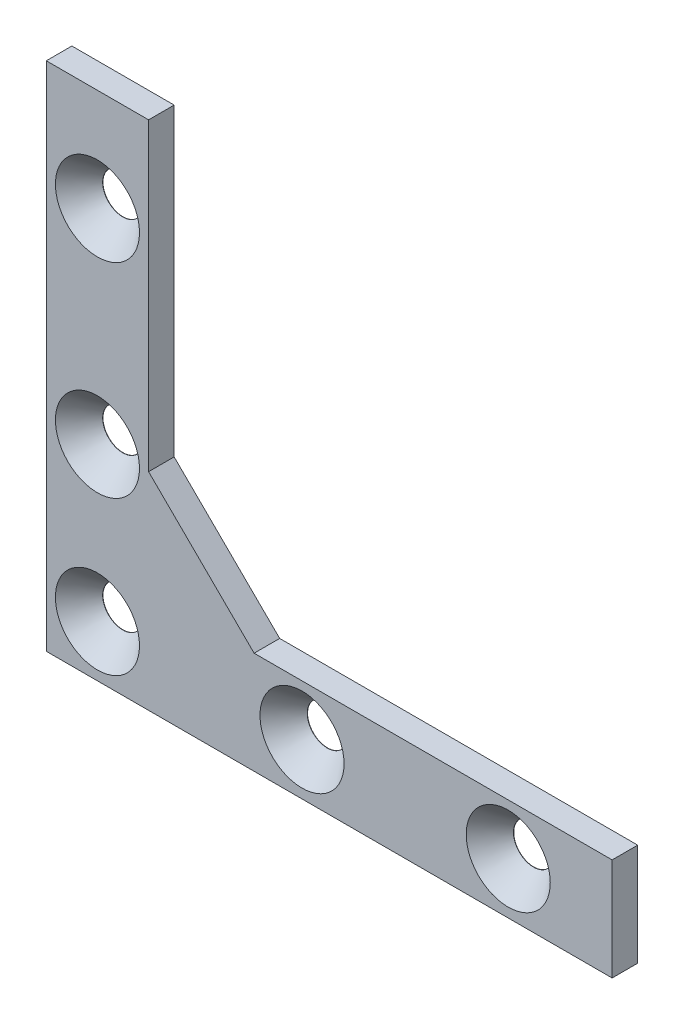
ISO-10303-21;
HEADER;
FILE_DESCRIPTION(('STEP AP214'),'2;1');
FILE_NAME('part.step','',(''),(''),'','','');
FILE_SCHEMA(('AUTOMOTIVE_DESIGN { 1 0 10303 214 1 1 1 1 }'));
ENDSEC;
DATA;
#1=APPLICATION_CONTEXT('core data for automotive mechanical design processes');
#2=APPLICATION_PROTOCOL_DEFINITION('international standard','automotive_design',2000,#1);
#3=PRODUCT_CONTEXT('',#1,'mechanical');
#4=PRODUCT('Part','Part','',(#3));
#5=PRODUCT_RELATED_PRODUCT_CATEGORY('part','',(#4));
#6=PRODUCT_DEFINITION_FORMATION('','',#4);
#7=PRODUCT_DEFINITION_CONTEXT('part definition',#1,'design');
#8=PRODUCT_DEFINITION('design','',#6,#7);
#9=PRODUCT_DEFINITION_SHAPE('','',#8);
#10=(LENGTH_UNIT() NAMED_UNIT(*) SI_UNIT(.MILLI.,.METRE.));
#11=(NAMED_UNIT(*) PLANE_ANGLE_UNIT() SI_UNIT($,.RADIAN.));
#12=(NAMED_UNIT(*) SI_UNIT($,.STERADIAN.) SOLID_ANGLE_UNIT());
#13=UNCERTAINTY_MEASURE_WITH_UNIT(LENGTH_MEASURE(1.E-05),#10,'distance_accuracy_value','');
#14=(GEOMETRIC_REPRESENTATION_CONTEXT(3) GLOBAL_UNCERTAINTY_ASSIGNED_CONTEXT((#13)) GLOBAL_UNIT_ASSIGNED_CONTEXT((#10,
#11,#12)) REPRESENTATION_CONTEXT('',''));
#15=CARTESIAN_POINT('',(0.,0.,0.));
#16=DIRECTION('',(0.,0.,1.));
#17=DIRECTION('',(1.,0.,0.));
#18=AXIS2_PLACEMENT_3D('',#15,#16,#17);
#19=CARTESIAN_POINT('',(-203.200000508,0.,3.175));
#20=DIRECTION('',(-1.,0.,0.));
#21=DIRECTION('',(0.,0.,1.));
#22=AXIS2_PLACEMENT_3D('',#19,#20,#21);
#23=PLANE('',#22);
#24=DIRECTION('',(0.,1.,0.));
#25=VECTOR('',#24,1.);
#26=CARTESIAN_POINT('',(-203.200000508,0.,0.));
#27=LINE('',#26,#25);
#28=CARTESIAN_POINT('',(-203.200000508,0.,0.));
#29=VERTEX_POINT('',#28);
#30=CARTESIAN_POINT('',(-203.200000508,12.7,0.));
#31=VERTEX_POINT('',#30);
#32=EDGE_CURVE('E131',#29,#31,#27,.T.);
#33=ORIENTED_EDGE('',*,*,#32,.T.);
#34=DIRECTION('',(0.,0.,-1.));
#35=VECTOR('',#34,1.);
#36=CARTESIAN_POINT('',(-203.200000508,12.7,3.175));
#37=LINE('',#36,#35);
#38=CARTESIAN_POINT('',(-203.200000508,12.7,3.175));
#39=VERTEX_POINT('',#38);
#40=EDGE_CURVE('E45',#39,#31,#37,.T.);
#41=ORIENTED_EDGE('',*,*,#40,.F.);
#42=DIRECTION('',(0.,1.,0.));
#43=VECTOR('',#42,1.);
#44=CARTESIAN_POINT('',(-203.200000508,0.,3.175));
#45=LINE('',#44,#43);
#46=CARTESIAN_POINT('',(-203.200000508,0.,3.175));
#47=VERTEX_POINT('',#46);
#48=EDGE_CURVE('E94',#47,#39,#45,.T.);
#49=ORIENTED_EDGE('',*,*,#48,.F.);
#50=DIRECTION('',(0.,0.,-1.));
#51=VECTOR('',#50,1.);
#52=CARTESIAN_POINT('',(-203.200000508,0.,3.175));
#53=LINE('',#52,#51);
#54=EDGE_CURVE('E11',#47,#29,#53,.T.);
#55=ORIENTED_EDGE('',*,*,#54,.T.);
#56=EDGE_LOOP('',(#33,#41,#49,#55));
#57=FACE_BOUND('',#56,.T.);
#58=ADVANCED_FACE('F37',(#57),#23,.F.);
#59=CARTESIAN_POINT('',(-203.200000508,12.7,3.175));
#60=DIRECTION('',(0.,-1.,0.));
#61=DIRECTION('',(1.,0.,0.));
#62=AXIS2_PLACEMENT_3D('',#59,#60,#61);
#63=PLANE('',#62);
#64=DIRECTION('',(-1.,0.,0.));
#65=VECTOR('',#64,1.);
#66=CARTESIAN_POINT('',(-203.200000508,12.7,0.));
#67=LINE('',#66,#65);
#68=CARTESIAN_POINT('',(-247.650000508,12.7,0.));
#69=VERTEX_POINT('',#68);
#70=EDGE_CURVE('E133',#31,#69,#67,.T.);
#71=ORIENTED_EDGE('',*,*,#70,.T.);
#72=DIRECTION('',(0.,0.,-1.));
#73=VECTOR('',#72,1.);
#74=CARTESIAN_POINT('',(-247.650000508,12.7,3.175));
#75=LINE('',#74,#73);
#76=CARTESIAN_POINT('',(-247.650000508,12.7,3.175));
#77=VERTEX_POINT('',#76);
#78=EDGE_CURVE('E146',#77,#69,#75,.T.);
#79=ORIENTED_EDGE('',*,*,#78,.F.);
#80=DIRECTION('',(-1.,0.,0.));
#81=VECTOR('',#80,1.);
#82=CARTESIAN_POINT('',(-203.200000508,12.7,3.175));
#83=LINE('',#82,#81);
#84=EDGE_CURVE('E154',#39,#77,#83,.T.);
#85=ORIENTED_EDGE('',*,*,#84,.F.);
#86=ORIENTED_EDGE('',*,*,#40,.T.);
#87=EDGE_LOOP('',(#71,#79,#85,#86));
#88=FACE_BOUND('',#87,.T.);
#89=ADVANCED_FACE('F152',(#88),#63,.F.);
#90=CARTESIAN_POINT('',(-247.650000508,12.7,3.175));
#91=DIRECTION('',(-0.703372247790285,-0.710821694265476,0.));
#92=DIRECTION('',(0.710821694265476,-0.703372247790285,0.));
#93=AXIS2_PLACEMENT_3D('',#90,#91,#92);
#94=PLANE('',#93);
#95=DIRECTION('',(-0.710821694265476,0.703372247790285,0.));
#96=VECTOR('',#95,1.);
#97=CARTESIAN_POINT('',(-247.650000508,12.7,0.));
#98=LINE('',#97,#96);
#99=CARTESIAN_POINT('',(-260.753367516007,25.6660430743707,0.));
#100=VERTEX_POINT('',#99);
#101=EDGE_CURVE('E136',#69,#100,#98,.T.);
#102=ORIENTED_EDGE('',*,*,#101,.T.);
#103=DIRECTION('',(0.,0.,-1.));
#104=VECTOR('',#103,1.);
#105=CARTESIAN_POINT('',(-260.753367516007,25.6660430743707,3.175));
#106=LINE('',#105,#104);
#107=CARTESIAN_POINT('',(-260.753367516007,25.6660430743707,3.175));
#108=VERTEX_POINT('',#107);
#109=EDGE_CURVE('E120',#108,#100,#106,.T.);
#110=ORIENTED_EDGE('',*,*,#109,.F.);
#111=DIRECTION('',(-0.710821694265476,0.703372247790285,0.));
#112=VECTOR('',#111,1.);
#113=CARTESIAN_POINT('',(-247.650000508,12.7,3.175));
#114=LINE('',#113,#112);
#115=EDGE_CURVE('E111',#77,#108,#114,.T.);
#116=ORIENTED_EDGE('',*,*,#115,.F.);
#117=ORIENTED_EDGE('',*,*,#78,.T.);
#118=EDGE_LOOP('',(#102,#110,#116,#117));
#119=FACE_BOUND('',#118,.T.);
#120=ADVANCED_FACE('F161',(#119),#94,.F.);
#121=CARTESIAN_POINT('',(-260.753367516007,25.6660430743707,3.175));
#122=DIRECTION('',(-1.,0.,0.));
#123=DIRECTION('',(0.,0.,1.));
#124=AXIS2_PLACEMENT_3D('',#121,#122,#123);
#125=PLANE('',#124);
#126=DIRECTION('',(0.,1.,0.));
#127=VECTOR('',#126,1.);
#128=CARTESIAN_POINT('',(-260.753367516007,25.6660430743707,0.));
#129=LINE('',#128,#127);
#130=CARTESIAN_POINT('',(-260.753367516007,63.5,0.));
#131=VERTEX_POINT('',#130);
#132=EDGE_CURVE('E119',#100,#131,#129,.T.);
#133=ORIENTED_EDGE('',*,*,#132,.T.);
#134=DIRECTION('',(0.,0.,-1.));
#135=VECTOR('',#134,1.);
#136=CARTESIAN_POINT('',(-260.753367516007,63.5,3.175));
#137=LINE('',#136,#135);
#138=CARTESIAN_POINT('',(-260.753367516007,63.5,3.175));
#139=VERTEX_POINT('',#138);
#140=EDGE_CURVE('E116',#139,#131,#137,.T.);
#141=ORIENTED_EDGE('',*,*,#140,.F.);
#142=DIRECTION('',(0.,1.,0.));
#143=VECTOR('',#142,1.);
#144=CARTESIAN_POINT('',(-260.753367516007,25.6660430743707,3.175));
#145=LINE('',#144,#143);
#146=EDGE_CURVE('E105',#108,#139,#145,.T.);
#147=ORIENTED_EDGE('',*,*,#146,.F.);
#148=ORIENTED_EDGE('',*,*,#109,.T.);
#149=EDGE_LOOP('',(#133,#141,#147,#148));
#150=FACE_BOUND('',#149,.T.);
#151=ADVANCED_FACE('F117',(#150),#125,.F.);
#152=CARTESIAN_POINT('',(-273.453367516007,63.5,3.175));
#153=DIRECTION('',(0.,-1.,0.));
#154=DIRECTION('',(0.,0.,-1.));
#155=AXIS2_PLACEMENT_3D('',#152,#153,#154);
#156=PLANE('',#155);
#157=DIRECTION('',(-1.,0.,0.));
#158=VECTOR('',#157,1.);
#159=CARTESIAN_POINT('',(-273.453367516007,63.5,0.));
#160=LINE('',#159,#158);
#161=CARTESIAN_POINT('',(-273.453367516007,63.5,0.));
#162=VERTEX_POINT('',#161);
#163=EDGE_CURVE('E80',#131,#162,#160,.T.);
#164=ORIENTED_EDGE('',*,*,#163,.T.);
#165=DIRECTION('',(0.,0.,-1.));
#166=VECTOR('',#165,1.);
#167=CARTESIAN_POINT('',(-273.453367516007,63.5,3.175));
#168=LINE('',#167,#166);
#169=CARTESIAN_POINT('',(-273.453367516007,63.5,3.175));
#170=VERTEX_POINT('',#169);
#171=EDGE_CURVE('E121',#170,#162,#168,.T.);
#172=ORIENTED_EDGE('',*,*,#171,.F.);
#173=DIRECTION('',(-1.,0.,0.));
#174=VECTOR('',#173,1.);
#175=CARTESIAN_POINT('',(-273.453367516007,63.5,3.175));
#176=LINE('',#175,#174);
#177=EDGE_CURVE('E109',#139,#170,#176,.T.);
#178=ORIENTED_EDGE('',*,*,#177,.F.);
#179=ORIENTED_EDGE('',*,*,#140,.T.);
#180=EDGE_LOOP('',(#164,#172,#178,#179));
#181=FACE_BOUND('',#180,.T.);
#182=ADVANCED_FACE('F123',(#181),#156,.F.);
#183=CARTESIAN_POINT('',(-273.453367516007,0.,3.175));
#184=DIRECTION('',(1.,0.,0.));
#185=DIRECTION('',(0.,0.,-1.));
#186=AXIS2_PLACEMENT_3D('',#183,#184,#185);
#187=PLANE('',#186);
#188=DIRECTION('',(0.,-1.,0.));
#189=VECTOR('',#188,1.);
#190=CARTESIAN_POINT('',(-273.453367516007,0.,0.));
#191=LINE('',#190,#189);
#192=CARTESIAN_POINT('',(-273.453367516007,0.,0.));
#193=VERTEX_POINT('',#192);
#194=EDGE_CURVE('E87',#162,#193,#191,.T.);
#195=ORIENTED_EDGE('',*,*,#194,.T.);
#196=DIRECTION('',(0.,0.,-1.));
#197=VECTOR('',#196,1.);
#198=CARTESIAN_POINT('',(-273.453367516007,0.,3.175));
#199=LINE('',#198,#197);
#200=CARTESIAN_POINT('',(-273.453367516007,0.,3.175));
#201=VERTEX_POINT('',#200);
#202=EDGE_CURVE('E127',#201,#193,#199,.T.);
#203=ORIENTED_EDGE('',*,*,#202,.F.);
#204=DIRECTION('',(0.,-1.,0.));
#205=VECTOR('',#204,1.);
#206=CARTESIAN_POINT('',(-273.453367516007,0.,3.175));
#207=LINE('',#206,#205);
#208=EDGE_CURVE('E125',#170,#201,#207,.T.);
#209=ORIENTED_EDGE('',*,*,#208,.F.);
#210=ORIENTED_EDGE('',*,*,#171,.T.);
#211=EDGE_LOOP('',(#195,#203,#209,#210));
#212=FACE_BOUND('',#211,.T.);
#213=ADVANCED_FACE('F245',(#212),#187,.F.);
#214=CARTESIAN_POINT('',(-260.350000508,0.,3.175));
#215=DIRECTION('',(0.,1.,0.));
#216=DIRECTION('',(-1.,0.,0.));
#217=AXIS2_PLACEMENT_3D('',#214,#215,#216);
#218=PLANE('',#217);
#219=DIRECTION('',(1.,0.,0.));
#220=VECTOR('',#219,1.);
#221=CARTESIAN_POINT('',(-260.350000508,0.,0.));
#222=LINE('',#221,#220);
#223=EDGE_CURVE('E141',#193,#29,#222,.T.);
#224=ORIENTED_EDGE('',*,*,#223,.T.);
#225=ORIENTED_EDGE('',*,*,#54,.F.);
#226=DIRECTION('',(1.,0.,0.));
#227=VECTOR('',#226,1.);
#228=CARTESIAN_POINT('',(-260.350000508,0.,3.175));
#229=LINE('',#228,#227);
#230=EDGE_CURVE('E53',#201,#47,#229,.T.);
#231=ORIENTED_EDGE('',*,*,#230,.F.);
#232=ORIENTED_EDGE('',*,*,#202,.T.);
#233=EDGE_LOOP('',(#224,#225,#231,#232));
#234=FACE_BOUND('',#233,.T.);
#235=ADVANCED_FACE('F215',(#234),#218,.F.);
#236=CARTESIAN_POINT('',(0.,0.,3.175));
#237=DIRECTION('',(0.,0.,1.));
#238=DIRECTION('',(1.,0.,0.));
#239=AXIS2_PLACEMENT_3D('',#236,#237,#238);
#240=PLANE('',#239);
#241=CARTESIAN_POINT('',(-267.103367516007,6.38822941469469,3.175));
#242=DIRECTION('',(0.,0.,1.));
#243=DIRECTION('',(1.,0.,0.));
#244=AXIS2_PLACEMENT_3D('',#241,#242,#243);
#245=CIRCLE('',#244,5.21969999999999);
#246=CARTESIAN_POINT('',(-261.883667516008,6.38822941469469,3.175));
#247=VERTEX_POINT('',#246);
#248=EDGE_CURVE('E207',#247,#247,#245,.T.);
#249=ORIENTED_EDGE('',*,*,#248,.F.);
#250=EDGE_LOOP('',(#249));
#251=FACE_BOUND('',#250,.T.);
#252=CARTESIAN_POINT('',(-267.103367516007,25.4382294146947,3.175));
#253=DIRECTION('',(0.,0.,1.));
#254=DIRECTION('',(1.,0.,0.));
#255=AXIS2_PLACEMENT_3D('',#252,#253,#254);
#256=CIRCLE('',#255,5.21969999999999);
#257=CARTESIAN_POINT('',(-261.883667516008,25.4382294146947,3.175));
#258=VERTEX_POINT('',#257);
#259=EDGE_CURVE('E198',#258,#258,#256,.T.);
#260=ORIENTED_EDGE('',*,*,#259,.F.);
#261=EDGE_LOOP('',(#260));
#262=FACE_BOUND('',#261,.T.);
#263=CARTESIAN_POINT('',(-267.103367516007,50.8,3.175));
#264=DIRECTION('',(0.,0.,1.));
#265=DIRECTION('',(1.,0.,0.));
#266=AXIS2_PLACEMENT_3D('',#263,#264,#265);
#267=CIRCLE('',#266,5.21969999999999);
#268=CARTESIAN_POINT('',(-261.883667516008,50.8,3.175));
#269=VERTEX_POINT('',#268);
#270=EDGE_CURVE('E189',#269,#269,#267,.T.);
#271=ORIENTED_EDGE('',*,*,#270,.F.);
#272=EDGE_LOOP('',(#271));
#273=FACE_BOUND('',#272,.T.);
#274=CARTESIAN_POINT('',(-241.703367516007,6.38822941469469,3.175));
#275=DIRECTION('',(0.,0.,1.));
#276=DIRECTION('',(1.,0.,0.));
#277=AXIS2_PLACEMENT_3D('',#274,#275,#276);
#278=CIRCLE('',#277,5.21969999999999);
#279=CARTESIAN_POINT('',(-236.483667516008,6.38822941469469,3.175));
#280=VERTEX_POINT('',#279);
#281=EDGE_CURVE('E180',#280,#280,#278,.T.);
#282=ORIENTED_EDGE('',*,*,#281,.F.);
#283=EDGE_LOOP('',(#282));
#284=FACE_BOUND('',#283,.T.);
#285=CARTESIAN_POINT('',(-216.101684012004,6.38822941469469,3.175));
#286=DIRECTION('',(0.,0.,1.));
#287=DIRECTION('',(1.,0.,0.));
#288=AXIS2_PLACEMENT_3D('',#285,#286,#287);
#289=CIRCLE('',#288,5.21969999999999);
#290=CARTESIAN_POINT('',(-210.881984012004,6.38822941469469,3.175));
#291=VERTEX_POINT('',#290);
#292=EDGE_CURVE('E171',#291,#291,#289,.T.);
#293=ORIENTED_EDGE('',*,*,#292,.F.);
#294=EDGE_LOOP('',(#293));
#295=FACE_BOUND('',#294,.T.);
#296=ORIENTED_EDGE('',*,*,#230,.T.);
#297=ORIENTED_EDGE('',*,*,#48,.T.);
#298=ORIENTED_EDGE('',*,*,#84,.T.);
#299=ORIENTED_EDGE('',*,*,#115,.T.);
#300=ORIENTED_EDGE('',*,*,#146,.T.);
#301=ORIENTED_EDGE('',*,*,#177,.T.);
#302=ORIENTED_EDGE('',*,*,#208,.T.);
#303=EDGE_LOOP('',(#296,#297,#298,#299,#300,#301,#302));
#304=FACE_BOUND('',#303,.T.);
#305=ADVANCED_FACE('F107',(#251,#262,#273,#284,#295,#304),#240,.T.);
#306=CARTESIAN_POINT('',(0.,0.,0.));
#307=DIRECTION('',(0.,0.,1.));
#308=DIRECTION('',(1.,0.,0.));
#309=AXIS2_PLACEMENT_3D('',#306,#307,#308);
#310=PLANE('',#309);
#311=CARTESIAN_POINT('',(-267.103367516007,6.38822941469469,0.));
#312=DIRECTION('',(0.,0.,1.));
#313=DIRECTION('',(1.,0.,0.));
#314=AXIS2_PLACEMENT_3D('',#311,#312,#313);
#315=CIRCLE('',#314,2.48920000000002);
#316=CARTESIAN_POINT('',(-264.614167516007,6.38822941469469,0.));
#317=VERTEX_POINT('',#316);
#318=EDGE_CURVE('E201',#317,#317,#315,.T.);
#319=ORIENTED_EDGE('',*,*,#318,.T.);
#320=EDGE_LOOP('',(#319));
#321=FACE_BOUND('',#320,.T.);
#322=CARTESIAN_POINT('',(-267.103367516007,25.4382294146947,0.));
#323=DIRECTION('',(0.,0.,1.));
#324=DIRECTION('',(1.,0.,0.));
#325=AXIS2_PLACEMENT_3D('',#322,#323,#324);
#326=CIRCLE('',#325,2.48920000000002);
#327=CARTESIAN_POINT('',(-264.614167516007,25.4382294146947,0.));
#328=VERTEX_POINT('',#327);
#329=EDGE_CURVE('E192',#328,#328,#326,.T.);
#330=ORIENTED_EDGE('',*,*,#329,.T.);
#331=EDGE_LOOP('',(#330));
#332=FACE_BOUND('',#331,.T.);
#333=CARTESIAN_POINT('',(-267.103367516007,50.8,0.));
#334=DIRECTION('',(0.,0.,1.));
#335=DIRECTION('',(1.,0.,0.));
#336=AXIS2_PLACEMENT_3D('',#333,#334,#335);
#337=CIRCLE('',#336,2.48920000000002);
#338=CARTESIAN_POINT('',(-264.614167516007,50.8,0.));
#339=VERTEX_POINT('',#338);
#340=EDGE_CURVE('E183',#339,#339,#337,.T.);
#341=ORIENTED_EDGE('',*,*,#340,.T.);
#342=EDGE_LOOP('',(#341));
#343=FACE_BOUND('',#342,.T.);
#344=CARTESIAN_POINT('',(-241.703367516007,6.38822941469469,0.));
#345=DIRECTION('',(0.,0.,1.));
#346=DIRECTION('',(1.,0.,0.));
#347=AXIS2_PLACEMENT_3D('',#344,#345,#346);
#348=CIRCLE('',#347,2.4892);
#349=CARTESIAN_POINT('',(-239.214167516007,6.38822941469469,0.));
#350=VERTEX_POINT('',#349);
#351=EDGE_CURVE('E174',#350,#350,#348,.T.);
#352=ORIENTED_EDGE('',*,*,#351,.T.);
#353=EDGE_LOOP('',(#352));
#354=FACE_BOUND('',#353,.T.);
#355=CARTESIAN_POINT('',(-216.101684012004,6.38822941469469,0.));
#356=DIRECTION('',(0.,0.,1.));
#357=DIRECTION('',(1.,0.,0.));
#358=AXIS2_PLACEMENT_3D('',#355,#356,#357);
#359=CIRCLE('',#358,2.4892);
#360=CARTESIAN_POINT('',(-213.612484012004,6.38822941469469,0.));
#361=VERTEX_POINT('',#360);
#362=EDGE_CURVE('E134',#361,#361,#359,.T.);
#363=ORIENTED_EDGE('',*,*,#362,.T.);
#364=EDGE_LOOP('',(#363));
#365=FACE_BOUND('',#364,.T.);
#366=ORIENTED_EDGE('',*,*,#32,.F.);
#367=ORIENTED_EDGE('',*,*,#223,.F.);
#368=ORIENTED_EDGE('',*,*,#194,.F.);
#369=ORIENTED_EDGE('',*,*,#163,.F.);
#370=ORIENTED_EDGE('',*,*,#132,.F.);
#371=ORIENTED_EDGE('',*,*,#101,.F.);
#372=ORIENTED_EDGE('',*,*,#70,.F.);
#373=EDGE_LOOP('',(#366,#367,#368,#369,#370,#371,#372));
#374=FACE_BOUND('',#373,.T.);
#375=ADVANCED_FACE('F158',(#321,#332,#343,#354,#365,#374),#310,.F.);
#376=CARTESIAN_POINT('',(-216.101684012004,6.38822941469469,3.175));
#377=DIRECTION('',(0.,0.,1.));
#378=DIRECTION('',(1.,0.,0.));
#379=AXIS2_PLACEMENT_3D('',#376,#377,#378);
#380=CYLINDRICAL_SURFACE('',#379,2.4892);
#381=ORIENTED_EDGE('',*,*,#362,.F.);
#382=EDGE_LOOP('',(#381));
#383=FACE_BOUND('',#382,.T.);
#384=CARTESIAN_POINT('',(-216.101684012004,6.38822941469469,0.0339190640830126));
#385=DIRECTION('',(0.,0.,1.));
#386=DIRECTION('',(1.,0.,0.));
#387=AXIS2_PLACEMENT_3D('',#384,#385,#386);
#388=CIRCLE('',#387,2.4892);
#389=CARTESIAN_POINT('',(-213.612484012004,6.38822941469469,0.0339190640830126));
#390=VERTEX_POINT('',#389);
#391=EDGE_CURVE('E168',#390,#390,#388,.T.);
#392=ORIENTED_EDGE('',*,*,#391,.T.);
#393=EDGE_LOOP('',(#392));
#394=FACE_BOUND('',#393,.T.);
#395=ADVANCED_FACE('F228',(#383,#394),#380,.F.);
#396=CARTESIAN_POINT('',(-216.101684012004,6.38822941469469,3.175));
#397=DIRECTION('',(0.,0.,1.));
#398=DIRECTION('',(1.,0.,0.));
#399=AXIS2_PLACEMENT_3D('',#396,#397,#398);
#400=CONICAL_SURFACE('',#399,5.21969999999999,0.715584993317671);
#401=ORIENTED_EDGE('',*,*,#391,.F.);
#402=EDGE_LOOP('',(#401));
#403=FACE_BOUND('',#402,.T.);
#404=ORIENTED_EDGE('',*,*,#292,.T.);
#405=EDGE_LOOP('',(#404));
#406=FACE_BOUND('',#405,.T.);
#407=ADVANCED_FACE('F225',(#403,#406),#400,.F.);
#408=CARTESIAN_POINT('',(-241.703367516007,6.38822941469469,3.175));
#409=DIRECTION('',(0.,0.,1.));
#410=DIRECTION('',(1.,0.,0.));
#411=AXIS2_PLACEMENT_3D('',#408,#409,#410);
#412=CYLINDRICAL_SURFACE('',#411,2.4892);
#413=ORIENTED_EDGE('',*,*,#351,.F.);
#414=EDGE_LOOP('',(#413));
#415=FACE_BOUND('',#414,.T.);
#416=CARTESIAN_POINT('',(-241.703367516007,6.38822941469469,0.0339190640830126));
#417=DIRECTION('',(0.,0.,1.));
#418=DIRECTION('',(1.,0.,0.));
#419=AXIS2_PLACEMENT_3D('',#416,#417,#418);
#420=CIRCLE('',#419,2.4892);
#421=CARTESIAN_POINT('',(-239.214167516007,6.38822941469469,0.0339190640830126));
#422=VERTEX_POINT('',#421);
#423=EDGE_CURVE('E177',#422,#422,#420,.T.);
#424=ORIENTED_EDGE('',*,*,#423,.T.);
#425=EDGE_LOOP('',(#424));
#426=FACE_BOUND('',#425,.T.);
#427=ADVANCED_FACE('F227',(#415,#426),#412,.F.);
#428=CARTESIAN_POINT('',(-241.703367516007,6.38822941469469,3.175));
#429=DIRECTION('',(0.,0.,1.));
#430=DIRECTION('',(1.,0.,0.));
#431=AXIS2_PLACEMENT_3D('',#428,#429,#430);
#432=CONICAL_SURFACE('',#431,5.21969999999999,0.715584993317671);
#433=ORIENTED_EDGE('',*,*,#423,.F.);
#434=EDGE_LOOP('',(#433));
#435=FACE_BOUND('',#434,.T.);
#436=ORIENTED_EDGE('',*,*,#281,.T.);
#437=EDGE_LOOP('',(#436));
#438=FACE_BOUND('',#437,.T.);
#439=ADVANCED_FACE('F235',(#435,#438),#432,.F.);
#440=CARTESIAN_POINT('',(-267.103367516007,50.8,3.175));
#441=DIRECTION('',(0.,0.,1.));
#442=DIRECTION('',(1.,0.,0.));
#443=AXIS2_PLACEMENT_3D('',#440,#441,#442);
#444=CYLINDRICAL_SURFACE('',#443,2.4892);
#445=ORIENTED_EDGE('',*,*,#340,.F.);
#446=EDGE_LOOP('',(#445));
#447=FACE_BOUND('',#446,.T.);
#448=CARTESIAN_POINT('',(-267.103367516007,50.8,0.0339190640830126));
#449=DIRECTION('',(0.,0.,1.));
#450=DIRECTION('',(1.,0.,0.));
#451=AXIS2_PLACEMENT_3D('',#448,#449,#450);
#452=CIRCLE('',#451,2.48919999999997);
#453=CARTESIAN_POINT('',(-264.614167516008,50.8,0.0339190640830126));
#454=VERTEX_POINT('',#453);
#455=EDGE_CURVE('E186',#454,#454,#452,.T.);
#456=ORIENTED_EDGE('',*,*,#455,.T.);
#457=EDGE_LOOP('',(#456));
#458=FACE_BOUND('',#457,.T.);
#459=ADVANCED_FACE('F328',(#447,#458),#444,.F.);
#460=CARTESIAN_POINT('',(-267.103367516007,50.8,3.175));
#461=DIRECTION('',(0.,0.,1.));
#462=DIRECTION('',(1.,0.,0.));
#463=AXIS2_PLACEMENT_3D('',#460,#461,#462);
#464=CONICAL_SURFACE('',#463,5.21969999999999,0.715584993317676);
#465=ORIENTED_EDGE('',*,*,#455,.F.);
#466=EDGE_LOOP('',(#465));
#467=FACE_BOUND('',#466,.T.);
#468=ORIENTED_EDGE('',*,*,#270,.T.);
#469=EDGE_LOOP('',(#468));
#470=FACE_BOUND('',#469,.T.);
#471=ADVANCED_FACE('F339',(#467,#470),#464,.F.);
#472=CARTESIAN_POINT('',(-267.103367516007,25.4382294146947,3.175));
#473=DIRECTION('',(0.,0.,1.));
#474=DIRECTION('',(1.,0.,0.));
#475=AXIS2_PLACEMENT_3D('',#472,#473,#474);
#476=CYLINDRICAL_SURFACE('',#475,2.4892);
#477=ORIENTED_EDGE('',*,*,#329,.F.);
#478=EDGE_LOOP('',(#477));
#479=FACE_BOUND('',#478,.T.);
#480=CARTESIAN_POINT('',(-267.103367516007,25.4382294146947,0.0339190640830126));
#481=DIRECTION('',(0.,0.,1.));
#482=DIRECTION('',(1.,0.,0.));
#483=AXIS2_PLACEMENT_3D('',#480,#481,#482);
#484=CIRCLE('',#483,2.48919999999997);
#485=CARTESIAN_POINT('',(-264.614167516008,25.4382294146947,0.0339190640830126));
#486=VERTEX_POINT('',#485);
#487=EDGE_CURVE('E195',#486,#486,#484,.T.);
#488=ORIENTED_EDGE('',*,*,#487,.T.);
#489=EDGE_LOOP('',(#488));
#490=FACE_BOUND('',#489,.T.);
#491=ADVANCED_FACE('F350',(#479,#490),#476,.F.);
#492=CARTESIAN_POINT('',(-267.103367516007,25.4382294146947,3.175));
#493=DIRECTION('',(0.,0.,1.));
#494=DIRECTION('',(1.,0.,0.));
#495=AXIS2_PLACEMENT_3D('',#492,#493,#494);
#496=CONICAL_SURFACE('',#495,5.21969999999999,0.715584993317676);
#497=ORIENTED_EDGE('',*,*,#487,.F.);
#498=EDGE_LOOP('',(#497));
#499=FACE_BOUND('',#498,.T.);
#500=ORIENTED_EDGE('',*,*,#259,.T.);
#501=EDGE_LOOP('',(#500));
#502=FACE_BOUND('',#501,.T.);
#503=ADVANCED_FACE('F361',(#499,#502),#496,.F.);
#504=CARTESIAN_POINT('',(-267.103367516007,6.38822941469469,3.175));
#505=DIRECTION('',(0.,0.,1.));
#506=DIRECTION('',(1.,0.,0.));
#507=AXIS2_PLACEMENT_3D('',#504,#505,#506);
#508=CYLINDRICAL_SURFACE('',#507,2.4892);
#509=ORIENTED_EDGE('',*,*,#318,.F.);
#510=EDGE_LOOP('',(#509));
#511=FACE_BOUND('',#510,.T.);
#512=CARTESIAN_POINT('',(-267.103367516007,6.38822941469469,0.0339190640830126));
#513=DIRECTION('',(0.,0.,1.));
#514=DIRECTION('',(1.,0.,0.));
#515=AXIS2_PLACEMENT_3D('',#512,#513,#514);
#516=CIRCLE('',#515,2.48919999999997);
#517=CARTESIAN_POINT('',(-264.614167516008,6.38822941469469,0.0339190640830126));
#518=VERTEX_POINT('',#517);
#519=EDGE_CURVE('E204',#518,#518,#516,.T.);
#520=ORIENTED_EDGE('',*,*,#519,.T.);
#521=EDGE_LOOP('',(#520));
#522=FACE_BOUND('',#521,.T.);
#523=ADVANCED_FACE('F372',(#511,#522),#508,.F.);
#524=CARTESIAN_POINT('',(-267.103367516007,6.38822941469469,3.175));
#525=DIRECTION('',(0.,0.,1.));
#526=DIRECTION('',(1.,0.,0.));
#527=AXIS2_PLACEMENT_3D('',#524,#525,#526);
#528=CONICAL_SURFACE('',#527,5.21969999999999,0.715584993317676);
#529=ORIENTED_EDGE('',*,*,#519,.F.);
#530=EDGE_LOOP('',(#529));
#531=FACE_BOUND('',#530,.T.);
#532=ORIENTED_EDGE('',*,*,#248,.T.);
#533=EDGE_LOOP('',(#532));
#534=FACE_BOUND('',#533,.T.);
#535=ADVANCED_FACE('F211',(#531,#534),#528,.F.);
#536=CLOSED_SHELL('',(#58,#89,#120,#151,#182,#213,#235,#305,#375,#395,#407,#427,#439,#459,#471,
#491,#503,#523,#535));
#537=MANIFOLD_SOLID_BREP('B2',#536);
#538=ADVANCED_BREP_SHAPE_REPRESENTATION('',(#18,#537),#14);
#539=SHAPE_DEFINITION_REPRESENTATION(#9,#538);
ENDSEC;
END-ISO-10303-21;
